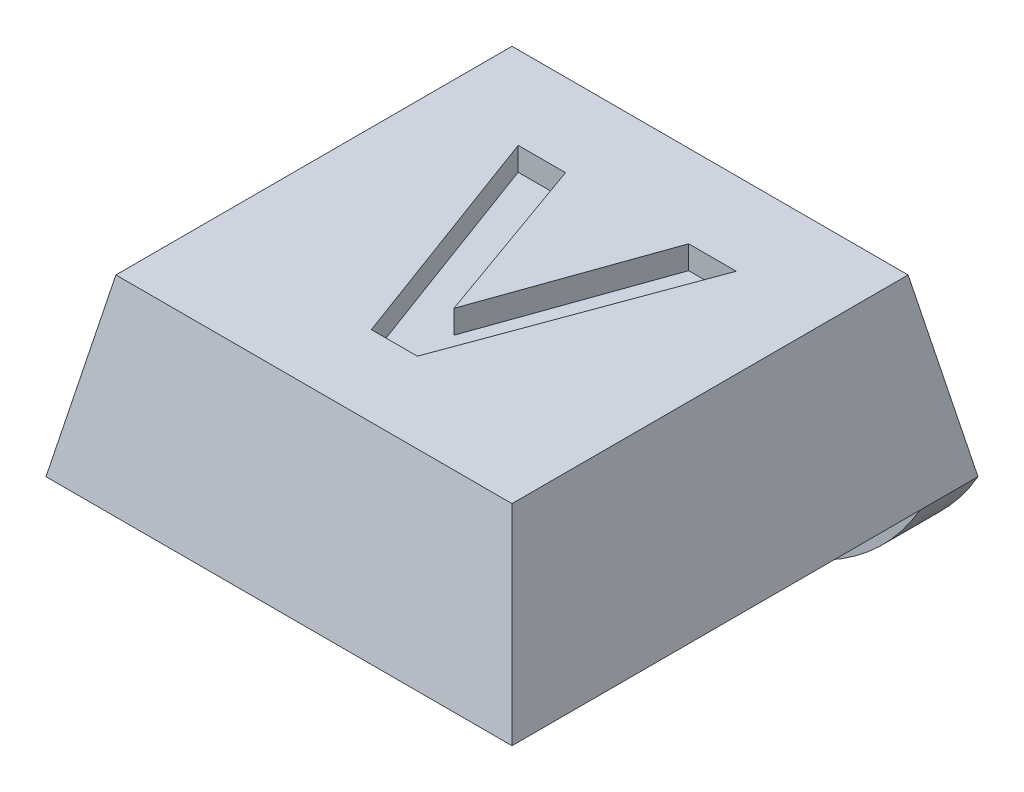
ISO-10303-21;
HEADER;
FILE_DESCRIPTION(('STEP AP214'),'2;1');
FILE_NAME('part.step','',(''),(''),'','','');
FILE_SCHEMA(('AUTOMOTIVE_DESIGN { 1 0 10303 214 1 1 1 1 }'));
ENDSEC;
DATA;
#1=APPLICATION_CONTEXT('core data for automotive mechanical design processes');
#2=APPLICATION_PROTOCOL_DEFINITION('international standard','automotive_design',2000,#1);
#3=PRODUCT_CONTEXT('',#1,'mechanical');
#4=PRODUCT('Part','Part','',(#3));
#5=PRODUCT_RELATED_PRODUCT_CATEGORY('part','',(#4));
#6=PRODUCT_DEFINITION_FORMATION('','',#4);
#7=PRODUCT_DEFINITION_CONTEXT('part definition',#1,'design');
#8=PRODUCT_DEFINITION('design','',#6,#7);
#9=PRODUCT_DEFINITION_SHAPE('','',#8);
#10=(LENGTH_UNIT() NAMED_UNIT(*) SI_UNIT(.MILLI.,.METRE.));
#11=(NAMED_UNIT(*) PLANE_ANGLE_UNIT() SI_UNIT($,.RADIAN.));
#12=(NAMED_UNIT(*) SI_UNIT($,.STERADIAN.) SOLID_ANGLE_UNIT());
#13=UNCERTAINTY_MEASURE_WITH_UNIT(LENGTH_MEASURE(1.E-05),#10,'distance_accuracy_value','');
#14=(GEOMETRIC_REPRESENTATION_CONTEXT(3) GLOBAL_UNCERTAINTY_ASSIGNED_CONTEXT((#13)) GLOBAL_UNIT_ASSIGNED_CONTEXT((#10,
#11,#12)) REPRESENTATION_CONTEXT('',''));
#15=CARTESIAN_POINT('',(0.,0.,0.));
#16=DIRECTION('',(0.,0.,1.));
#17=DIRECTION('',(1.,0.,0.));
#18=AXIS2_PLACEMENT_3D('',#15,#16,#17);
#19=CARTESIAN_POINT('',(0.,3.,0.));
#20=DIRECTION('',(0.,-1.,0.));
#21=DIRECTION('',(0.,0.,-1.));
#22=AXIS2_PLACEMENT_3D('',#19,#20,#21);
#23=PLANE('',#22);
#24=DIRECTION('',(-1.,0.,0.));
#25=VECTOR('',#24,1.);
#26=CARTESIAN_POINT('',(11.,3.,-0.6));
#27=LINE('',#26,#25);
#28=CARTESIAN_POINT('',(7.4,3.,-0.6));
#29=VERTEX_POINT('',#28);
#30=CARTESIAN_POINT('',(0.6,3.,-0.6));
#31=VERTEX_POINT('',#30);
#32=EDGE_CURVE('E200',#29,#31,#27,.T.);
#33=ORIENTED_EDGE('',*,*,#32,.F.);
#34=DIRECTION('',(0.,0.,1.));
#35=VECTOR('',#34,1.);
#36=CARTESIAN_POINT('',(7.4,3.,-8.));
#37=LINE('',#36,#35);
#38=CARTESIAN_POINT('',(7.4,3.,-7.4));
#39=VERTEX_POINT('',#38);
#40=EDGE_CURVE('E213',#39,#29,#37,.T.);
#41=ORIENTED_EDGE('',*,*,#40,.F.);
#42=DIRECTION('',(-1.,0.,0.));
#43=VECTOR('',#42,1.);
#44=CARTESIAN_POINT('',(11.,3.,-7.4));
#45=LINE('',#44,#43);
#46=CARTESIAN_POINT('',(0.599999999999999,3.,-7.4));
#47=VERTEX_POINT('',#46);
#48=EDGE_CURVE('E196',#39,#47,#45,.T.);
#49=ORIENTED_EDGE('',*,*,#48,.T.);
#50=DIRECTION('',(0.,0.,1.));
#51=VECTOR('',#50,1.);
#52=CARTESIAN_POINT('',(0.6,3.,-8.));
#53=LINE('',#52,#51);
#54=EDGE_CURVE('E216',#47,#31,#53,.T.);
#55=ORIENTED_EDGE('',*,*,#54,.T.);
#56=EDGE_LOOP('',(#33,#41,#49,#55));
#57=FACE_BOUND('',#56,.T.);
#58=DIRECTION('',(-1.,0.,0.));
#59=VECTOR('',#58,1.);
#60=CARTESIAN_POINT('',(4.39628987339704,3.,-1.97972373207462));
#61=LINE('',#60,#59);
#62=CARTESIAN_POINT('',(4.39628987339704,3.,-1.97972373207462));
#63=VERTEX_POINT('',#62);
#64=CARTESIAN_POINT('',(3.60542448878166,3.,-1.97972373207462));
#65=VERTEX_POINT('',#64);
#66=EDGE_CURVE('E59',#63,#65,#61,.T.);
#67=ORIENTED_EDGE('',*,*,#66,.T.);
#68=DIRECTION('',(-0.346837004095032,0.,-0.937925419524593));
#69=VECTOR('',#68,1.);
#70=CARTESIAN_POINT('',(3.60542448878166,3.,-1.97972373207462));
#71=LINE('',#70,#69);
#72=CARTESIAN_POINT('',(2.12625782211499,3.,-5.97972373207462));
#73=VERTEX_POINT('',#72);
#74=EDGE_CURVE('E168',#65,#73,#71,.T.);
#75=ORIENTED_EDGE('',*,*,#74,.T.);
#76=DIRECTION('',(1.,0.,0.));
#77=VECTOR('',#76,1.);
#78=CARTESIAN_POINT('',(2.12625782211499,3.,-5.97972373207462));
#79=LINE('',#78,#77);
#80=CARTESIAN_POINT('',(2.93875782211499,3.,-5.97972373207462));
#81=VERTEX_POINT('',#80);
#82=EDGE_CURVE('E562',#73,#81,#79,.T.);
#83=ORIENTED_EDGE('',*,*,#82,.T.);
#84=DIRECTION('',(0.335500275538548,0.,0.942040108017466));
#85=VECTOR('',#84,1.);
#86=CARTESIAN_POINT('',(2.93875782211499,3.,-5.97972373207462));
#87=LINE('',#86,#85);
#88=CARTESIAN_POINT('',(3.99805269390987,3.,-3.00536475771565));
#89=VERTEX_POINT('',#88);
#90=EDGE_CURVE('E543',#81,#89,#87,.T.);
#91=ORIENTED_EDGE('',*,*,#90,.T.);
#92=DIRECTION('',(0.33437347432051,0.,-0.942440650476639));
#93=VECTOR('',#92,1.);
#94=CARTESIAN_POINT('',(3.99805269390987,3.,-3.00536475771565));
#95=LINE('',#94,#93);
#96=CARTESIAN_POINT('',(5.05334115544833,3.,-5.97972373207462));
#97=VERTEX_POINT('',#96);
#98=EDGE_CURVE('E538',#89,#97,#95,.T.);
#99=ORIENTED_EDGE('',*,*,#98,.T.);
#100=DIRECTION('',(1.,0.,0.));
#101=VECTOR('',#100,1.);
#102=CARTESIAN_POINT('',(5.05334115544833,3.,-5.97972373207462));
#103=LINE('',#102,#101);
#104=CARTESIAN_POINT('',(5.86984756570474,3.,-5.97972373207462));
#105=VERTEX_POINT('',#104);
#106=EDGE_CURVE('E532',#97,#105,#103,.T.);
#107=ORIENTED_EDGE('',*,*,#106,.T.);
#108=DIRECTION('',(-0.345679226097517,0.,0.93835274425166));
#109=VECTOR('',#108,1.);
#110=CARTESIAN_POINT('',(5.86984756570474,3.,-5.97972373207462));
#111=LINE('',#110,#109);
#112=EDGE_CURVE('E164',#105,#63,#111,.T.);
#113=ORIENTED_EDGE('',*,*,#112,.T.);
#114=EDGE_LOOP('',(#67,#75,#83,#91,#99,#107,#113));
#115=FACE_BOUND('',#114,.T.);
#116=ADVANCED_FACE('F43',(#57,#115),#23,.F.);
#117=CARTESIAN_POINT('',(8.,0.,-8.));
#118=DIRECTION('',(-0.98058067569092,-0.196116135138184,0.));
#119=DIRECTION('',(0.196116135138184,-0.98058067569092,0.));
#120=AXIS2_PLACEMENT_3D('',#117,#118,#119);
#121=PLANE('',#120);
#122=DIRECTION('',(-0.192450089729875,0.962250448649376,-0.192450089729875));
#123=VECTOR('',#122,1.);
#124=CARTESIAN_POINT('',(7.7037037037037,1.48148148148148,-0.296296296296296));
#125=LINE('',#124,#123);
#126=CARTESIAN_POINT('',(8.,0.,0.));
#127=VERTEX_POINT('',#126);
#128=EDGE_CURVE('E210',#127,#29,#125,.T.);
#129=ORIENTED_EDGE('',*,*,#128,.F.);
#130=DIRECTION('',(0.,0.,-1.));
#131=VECTOR('',#130,1.);
#132=CARTESIAN_POINT('',(8.,0.,0.));
#133=LINE('',#132,#131);
#134=CARTESIAN_POINT('',(8.,0.,-7.));
#135=VERTEX_POINT('',#134);
#136=EDGE_CURVE('E229',#127,#135,#133,.T.);
#137=ORIENTED_EDGE('',*,*,#136,.T.);
#138=DIRECTION('',(0.,0.,1.));
#139=VECTOR('',#138,1.);
#140=CARTESIAN_POINT('',(8.,0.,-8.));
#141=LINE('',#140,#139);
#142=CARTESIAN_POINT('',(8.,0.,-8.));
#143=VERTEX_POINT('',#142);
#144=EDGE_CURVE('E170',#143,#135,#141,.T.);
#145=ORIENTED_EDGE('',*,*,#144,.F.);
#146=DIRECTION('',(0.192450089729875,-0.962250448649376,-0.192450089729875));
#147=VECTOR('',#146,1.);
#148=CARTESIAN_POINT('',(8.,0.,-8.));
#149=LINE('',#148,#147);
#150=EDGE_CURVE('E203',#39,#143,#149,.T.);
#151=ORIENTED_EDGE('',*,*,#150,.F.);
#152=ORIENTED_EDGE('',*,*,#40,.T.);
#153=EDGE_LOOP('',(#129,#137,#145,#151,#152));
#154=FACE_BOUND('',#153,.T.);
#155=ADVANCED_FACE('F297',(#154),#121,.F.);
#156=CARTESIAN_POINT('',(0.,0.,-8.));
#157=DIRECTION('',(0.98058067569092,-0.196116135138184,0.));
#158=DIRECTION('',(0.196116135138184,0.98058067569092,0.));
#159=AXIS2_PLACEMENT_3D('',#156,#157,#158);
#160=PLANE('',#159);
#161=DIRECTION('',(-0.192450089729875,-0.962250448649376,0.192450089729875));
#162=VECTOR('',#161,1.);
#163=CARTESIAN_POINT('',(0.296296296296296,1.48148148148148,-0.296296296296296));
#164=LINE('',#163,#162);
#165=CARTESIAN_POINT('',(0.,0.,0.));
#166=VERTEX_POINT('',#165);
#167=EDGE_CURVE('E257',#31,#166,#164,.T.);
#168=ORIENTED_EDGE('',*,*,#167,.F.);
#169=ORIENTED_EDGE('',*,*,#54,.F.);
#170=DIRECTION('',(0.192450089729875,0.962250448649376,0.192450089729875));
#171=VECTOR('',#170,1.);
#172=CARTESIAN_POINT('',(0.,0.,-8.));
#173=LINE('',#172,#171);
#174=CARTESIAN_POINT('',(0.,0.,-8.));
#175=VERTEX_POINT('',#174);
#176=EDGE_CURVE('E228',#175,#47,#173,.T.);
#177=ORIENTED_EDGE('',*,*,#176,.F.);
#178=DIRECTION('',(0.,0.,1.));
#179=VECTOR('',#178,1.);
#180=CARTESIAN_POINT('',(0.,0.,0.));
#181=LINE('',#180,#179);
#182=CARTESIAN_POINT('',(0.,0.,-7.));
#183=VERTEX_POINT('',#182);
#184=EDGE_CURVE('E233',#175,#183,#181,.T.);
#185=ORIENTED_EDGE('',*,*,#184,.T.);
#186=EDGE_CURVE('E220',#183,#166,#181,.T.);
#187=ORIENTED_EDGE('',*,*,#186,.T.);
#188=EDGE_LOOP('',(#168,#169,#177,#185,#187));
#189=FACE_BOUND('',#188,.T.);
#190=ADVANCED_FACE('F281',(#189),#160,.F.);
#191=CARTESIAN_POINT('',(0.,0.,0.));
#192=DIRECTION('',(0.,-1.,0.));
#193=DIRECTION('',(0.,0.,-1.));
#194=AXIS2_PLACEMENT_3D('',#191,#192,#193);
#195=PLANE('',#194);
#196=DIRECTION('',(-1.,0.,0.));
#197=VECTOR('',#196,1.);
#198=CARTESIAN_POINT('',(0.,0.,-7.));
#199=LINE('',#198,#197);
#200=EDGE_CURVE('E176',#135,#183,#199,.T.);
#201=ORIENTED_EDGE('',*,*,#200,.F.);
#202=ORIENTED_EDGE('',*,*,#136,.F.);
#203=DIRECTION('',(1.,0.,0.));
#204=VECTOR('',#203,1.);
#205=CARTESIAN_POINT('',(0.,0.,0.));
#206=LINE('',#205,#204);
#207=EDGE_CURVE('E230',#166,#127,#206,.T.);
#208=ORIENTED_EDGE('',*,*,#207,.F.);
#209=ORIENTED_EDGE('',*,*,#186,.F.);
#210=EDGE_LOOP('',(#201,#202,#208,#209));
#211=FACE_BOUND('',#210,.T.);
#212=CARTESIAN_POINT('',(4.,0.,-3.75));
#213=DIRECTION('',(0.,-1.,0.));
#214=DIRECTION('',(0.,0.,-1.));
#215=AXIS2_PLACEMENT_3D('',#212,#213,#214);
#216=CIRCLE('',#215,1.75);
#217=CARTESIAN_POINT('',(4.,0.,-5.5));
#218=VERTEX_POINT('',#217);
#219=EDGE_CURVE('E188',#218,#218,#216,.T.);
#220=ORIENTED_EDGE('',*,*,#219,.F.);
#221=EDGE_LOOP('',(#220));
#222=FACE_BOUND('',#221,.T.);
#223=ADVANCED_FACE('F292',(#211,#222),#195,.T.);
#224=CARTESIAN_POINT('',(11.,3.,-7.4));
#225=DIRECTION('',(0.,0.196116135138184,-0.98058067569092));
#226=DIRECTION('',(0.,0.98058067569092,0.196116135138184));
#227=AXIS2_PLACEMENT_3D('',#224,#225,#226);
#228=PLANE('',#227);
#229=ORIENTED_EDGE('',*,*,#150,.T.);
#230=DIRECTION('',(-1.,0.,0.));
#231=VECTOR('',#230,1.);
#232=CARTESIAN_POINT('',(0.,0.,-8.));
#233=LINE('',#232,#231);
#234=EDGE_CURVE('E224',#143,#175,#233,.T.);
#235=ORIENTED_EDGE('',*,*,#234,.T.);
#236=ORIENTED_EDGE('',*,*,#176,.T.);
#237=ORIENTED_EDGE('',*,*,#48,.F.);
#238=EDGE_LOOP('',(#229,#235,#236,#237));
#239=FACE_BOUND('',#238,.T.);
#240=ADVANCED_FACE('F276',(#239),#228,.T.);
#241=CARTESIAN_POINT('',(11.,0.,0.));
#242=DIRECTION('',(0.,0.196116135138184,0.98058067569092));
#243=DIRECTION('',(0.,-0.98058067569092,0.196116135138184));
#244=AXIS2_PLACEMENT_3D('',#241,#242,#243);
#245=PLANE('',#244);
#246=ORIENTED_EDGE('',*,*,#128,.T.);
#247=ORIENTED_EDGE('',*,*,#32,.T.);
#248=ORIENTED_EDGE('',*,*,#167,.T.);
#249=ORIENTED_EDGE('',*,*,#207,.T.);
#250=EDGE_LOOP('',(#246,#247,#248,#249));
#251=FACE_BOUND('',#250,.T.);
#252=ADVANCED_FACE('F321',(#251),#245,.T.);
#253=CARTESIAN_POINT('',(4.,0.4,-3.75));
#254=DIRECTION('',(0.,-1.,0.));
#255=DIRECTION('',(0.,0.,-1.));
#256=AXIS2_PLACEMENT_3D('',#253,#254,#255);
#257=CYLINDRICAL_SURFACE('',#256,1.75);
#258=CARTESIAN_POINT('',(4.,0.4,-3.75));
#259=DIRECTION('',(0.,-1.,0.));
#260=DIRECTION('',(0.,0.,-1.));
#261=AXIS2_PLACEMENT_3D('',#258,#259,#260);
#262=CIRCLE('',#261,1.75);
#263=CARTESIAN_POINT('',(4.,0.4,-5.5));
#264=VERTEX_POINT('',#263);
#265=EDGE_CURVE('E192',#264,#264,#262,.T.);
#266=ORIENTED_EDGE('',*,*,#265,.F.);
#267=EDGE_LOOP('',(#266));
#268=FACE_BOUND('',#267,.T.);
#269=ORIENTED_EDGE('',*,*,#219,.T.);
#270=EDGE_LOOP('',(#269));
#271=FACE_BOUND('',#270,.T.);
#272=ADVANCED_FACE('F328',(#268,#271),#257,.F.);
#273=CARTESIAN_POINT('',(4.,0.4,-3.75));
#274=DIRECTION('',(0.,-1.,0.));
#275=DIRECTION('',(0.,0.,-1.));
#276=AXIS2_PLACEMENT_3D('',#273,#274,#275);
#277=PLANE('',#276);
#278=ORIENTED_EDGE('',*,*,#265,.T.);
#279=EDGE_LOOP('',(#278));
#280=FACE_BOUND('',#279,.T.);
#281=ADVANCED_FACE('F332',(#280),#277,.T.);
#282=CARTESIAN_POINT('',(0.,-2.,-8.));
#283=DIRECTION('',(0.,0.,1.));
#284=DIRECTION('',(1.,0.,0.));
#285=AXIS2_PLACEMENT_3D('',#282,#283,#284);
#286=PLANE('',#285);
#287=ORIENTED_EDGE('',*,*,#234,.F.);
#288=CARTESIAN_POINT('',(4.53589838486225,2.,-8.));
#289=DIRECTION('',(0.,0.,1.));
#290=DIRECTION('',(1.,0.,0.));
#291=AXIS2_PLACEMENT_3D('',#288,#289,#290);
#292=CIRCLE('',#291,4.);
#293=CARTESIAN_POINT('',(4.53589838486225,-2.,-8.));
#294=VERTEX_POINT('',#293);
#295=EDGE_CURVE('E11',#143,#294,#292,.F.);
#296=ORIENTED_EDGE('',*,*,#295,.T.);
#297=DIRECTION('',(1.,0.,0.));
#298=VECTOR('',#297,1.);
#299=CARTESIAN_POINT('',(0.,-2.,-8.));
#300=LINE('',#299,#298);
#301=CARTESIAN_POINT('',(3.46410161513775,-2.,-8.));
#302=VERTEX_POINT('',#301);
#303=EDGE_CURVE('E182',#302,#294,#300,.T.);
#304=ORIENTED_EDGE('',*,*,#303,.F.);
#305=CARTESIAN_POINT('',(3.46410161513775,2.,-8.));
#306=DIRECTION('',(0.,0.,1.));
#307=DIRECTION('',(1.,0.,0.));
#308=AXIS2_PLACEMENT_3D('',#305,#306,#307);
#309=CIRCLE('',#308,4.);
#310=EDGE_CURVE('E52',#302,#175,#309,.F.);
#311=ORIENTED_EDGE('',*,*,#310,.T.);
#312=EDGE_LOOP('',(#287,#296,#304,#311));
#313=FACE_BOUND('',#312,.T.);
#314=ADVANCED_FACE('F269',(#313),#286,.F.);
#315=CARTESIAN_POINT('',(0.,-2.,-7.));
#316=DIRECTION('',(0.,0.,-1.));
#317=DIRECTION('',(-1.,0.,0.));
#318=AXIS2_PLACEMENT_3D('',#315,#316,#317);
#319=PLANE('',#318);
#320=DIRECTION('',(-1.,0.,0.));
#321=VECTOR('',#320,1.);
#322=CARTESIAN_POINT('',(0.,-2.,-7.));
#323=LINE('',#322,#321);
#324=CARTESIAN_POINT('',(4.53589838486225,-2.,-7.));
#325=VERTEX_POINT('',#324);
#326=CARTESIAN_POINT('',(3.46410161513775,-2.,-7.));
#327=VERTEX_POINT('',#326);
#328=EDGE_CURVE('E186',#325,#327,#323,.T.);
#329=ORIENTED_EDGE('',*,*,#328,.F.);
#330=CARTESIAN_POINT('',(4.53589838486225,2.,-7.));
#331=DIRECTION('',(0.,0.,-1.));
#332=DIRECTION('',(-1.,0.,0.));
#333=AXIS2_PLACEMENT_3D('',#330,#331,#332);
#334=CIRCLE('',#333,4.);
#335=EDGE_CURVE('E263',#325,#135,#334,.F.);
#336=ORIENTED_EDGE('',*,*,#335,.T.);
#337=ORIENTED_EDGE('',*,*,#200,.T.);
#338=CARTESIAN_POINT('',(3.46410161513775,2.,-7.));
#339=DIRECTION('',(0.,0.,-1.));
#340=DIRECTION('',(-1.,0.,0.));
#341=AXIS2_PLACEMENT_3D('',#338,#339,#340);
#342=CIRCLE('',#341,4.);
#343=EDGE_CURVE('E67',#183,#327,#342,.F.);
#344=ORIENTED_EDGE('',*,*,#343,.T.);
#345=EDGE_LOOP('',(#329,#336,#337,#344));
#346=FACE_BOUND('',#345,.T.);
#347=ADVANCED_FACE('F287',(#346),#319,.F.);
#348=CARTESIAN_POINT('',(0.,-2.,0.));
#349=DIRECTION('',(0.,1.,0.));
#350=DIRECTION('',(0.,0.,1.));
#351=AXIS2_PLACEMENT_3D('',#348,#349,#350);
#352=PLANE('',#351);
#353=ORIENTED_EDGE('',*,*,#303,.T.);
#354=DIRECTION('',(0.,0.,1.));
#355=VECTOR('',#354,1.);
#356=CARTESIAN_POINT('',(4.53589838486225,-2.,0.));
#357=LINE('',#356,#355);
#358=EDGE_CURVE('E256',#294,#325,#357,.T.);
#359=ORIENTED_EDGE('',*,*,#358,.T.);
#360=ORIENTED_EDGE('',*,*,#328,.T.);
#361=DIRECTION('',(0.,0.,-1.));
#362=VECTOR('',#361,1.);
#363=CARTESIAN_POINT('',(3.46410161513775,-2.,0.));
#364=LINE('',#363,#362);
#365=EDGE_CURVE('E252',#327,#302,#364,.T.);
#366=ORIENTED_EDGE('',*,*,#365,.T.);
#367=EDGE_LOOP('',(#353,#359,#360,#366));
#368=FACE_BOUND('',#367,.T.);
#369=ADVANCED_FACE('F285',(#368),#352,.F.);
#370=CARTESIAN_POINT('',(4.53589838486225,2.,-8.));
#371=DIRECTION('',(0.,0.,1.));
#372=DIRECTION('',(1.,0.,0.));
#373=AXIS2_PLACEMENT_3D('',#370,#371,#372);
#374=CYLINDRICAL_SURFACE('',#373,4.);
#375=ORIENTED_EDGE('',*,*,#295,.F.);
#376=ORIENTED_EDGE('',*,*,#144,.T.);
#377=ORIENTED_EDGE('',*,*,#335,.F.);
#378=ORIENTED_EDGE('',*,*,#358,.F.);
#379=EDGE_LOOP('',(#375,#376,#377,#378));
#380=FACE_BOUND('',#379,.T.);
#381=ADVANCED_FACE('F298',(#380),#374,.T.);
#382=CARTESIAN_POINT('',(3.46410161513775,2.,-8.));
#383=DIRECTION('',(0.,0.,-1.));
#384=DIRECTION('',(-1.,0.,0.));
#385=AXIS2_PLACEMENT_3D('',#382,#383,#384);
#386=CYLINDRICAL_SURFACE('',#385,4.);
#387=ORIENTED_EDGE('',*,*,#343,.F.);
#388=ORIENTED_EDGE('',*,*,#184,.F.);
#389=ORIENTED_EDGE('',*,*,#310,.F.);
#390=ORIENTED_EDGE('',*,*,#365,.F.);
#391=EDGE_LOOP('',(#387,#388,#389,#390));
#392=FACE_BOUND('',#391,.T.);
#393=ADVANCED_FACE('F45',(#392),#386,.T.);
#394=CARTESIAN_POINT('',(4.39628987339704,2.6,-1.97972373207462));
#395=DIRECTION('',(0.,0.,-1.));
#396=DIRECTION('',(-1.,0.,0.));
#397=AXIS2_PLACEMENT_3D('',#394,#395,#396);
#398=PLANE('',#397);
#399=ORIENTED_EDGE('',*,*,#66,.F.);
#400=DIRECTION('',(0.,1.,0.));
#401=VECTOR('',#400,1.);
#402=CARTESIAN_POINT('',(4.39628987339704,2.6,-1.97972373207462));
#403=LINE('',#402,#401);
#404=CARTESIAN_POINT('',(4.39628987339704,2.6,-1.97972373207462));
#405=VERTEX_POINT('',#404);
#406=EDGE_CURVE('E162',#405,#63,#403,.T.);
#407=ORIENTED_EDGE('',*,*,#406,.F.);
#408=DIRECTION('',(-1.,0.,0.));
#409=VECTOR('',#408,1.);
#410=CARTESIAN_POINT('',(4.39628987339704,2.6,-1.97972373207462));
#411=LINE('',#410,#409);
#412=CARTESIAN_POINT('',(3.60542448878166,2.6,-1.97972373207462));
#413=VERTEX_POINT('',#412);
#414=EDGE_CURVE('E152',#405,#413,#411,.T.);
#415=ORIENTED_EDGE('',*,*,#414,.T.);
#416=DIRECTION('',(0.,1.,0.));
#417=VECTOR('',#416,1.);
#418=CARTESIAN_POINT('',(3.60542448878166,2.6,-1.97972373207462));
#419=LINE('',#418,#417);
#420=EDGE_CURVE('E161',#413,#65,#419,.T.);
#421=ORIENTED_EDGE('',*,*,#420,.T.);
#422=EDGE_LOOP('',(#399,#407,#415,#421));
#423=FACE_BOUND('',#422,.T.);
#424=ADVANCED_FACE('F160',(#423),#398,.T.);
#425=CARTESIAN_POINT('',(3.60542448878166,2.6,-1.97972373207462));
#426=DIRECTION('',(0.937925419524593,0.,-0.346837004095032));
#427=DIRECTION('',(-0.346837004095032,0.,-0.937925419524593));
#428=AXIS2_PLACEMENT_3D('',#425,#426,#427);
#429=PLANE('',#428);
#430=ORIENTED_EDGE('',*,*,#74,.F.);
#431=ORIENTED_EDGE('',*,*,#420,.F.);
#432=DIRECTION('',(-0.346837004095032,0.,-0.937925419524593));
#433=VECTOR('',#432,1.);
#434=CARTESIAN_POINT('',(3.60542448878166,2.6,-1.97972373207462));
#435=LINE('',#434,#433);
#436=CARTESIAN_POINT('',(2.12625782211499,2.6,-5.97972373207462));
#437=VERTEX_POINT('',#436);
#438=EDGE_CURVE('E148',#413,#437,#435,.T.);
#439=ORIENTED_EDGE('',*,*,#438,.T.);
#440=DIRECTION('',(0.,1.,0.));
#441=VECTOR('',#440,1.);
#442=CARTESIAN_POINT('',(2.12625782211499,2.6,-5.97972373207462));
#443=LINE('',#442,#441);
#444=EDGE_CURVE('E171',#437,#73,#443,.T.);
#445=ORIENTED_EDGE('',*,*,#444,.T.);
#446=EDGE_LOOP('',(#430,#431,#439,#445));
#447=FACE_BOUND('',#446,.T.);
#448=ADVANCED_FACE('F166',(#447),#429,.T.);
#449=CARTESIAN_POINT('',(2.12625782211499,2.6,-5.97972373207462));
#450=DIRECTION('',(0.,0.,1.));
#451=DIRECTION('',(1.,0.,0.));
#452=AXIS2_PLACEMENT_3D('',#449,#450,#451);
#453=PLANE('',#452);
#454=ORIENTED_EDGE('',*,*,#82,.F.);
#455=ORIENTED_EDGE('',*,*,#444,.F.);
#456=DIRECTION('',(1.,0.,0.));
#457=VECTOR('',#456,1.);
#458=CARTESIAN_POINT('',(2.12625782211499,2.6,-5.97972373207462));
#459=LINE('',#458,#457);
#460=CARTESIAN_POINT('',(2.93875782211499,2.6,-5.97972373207462));
#461=VERTEX_POINT('',#460);
#462=EDGE_CURVE('E154',#437,#461,#459,.T.);
#463=ORIENTED_EDGE('',*,*,#462,.T.);
#464=DIRECTION('',(0.,1.,0.));
#465=VECTOR('',#464,1.);
#466=CARTESIAN_POINT('',(2.93875782211499,2.6,-5.97972373207462));
#467=LINE('',#466,#465);
#468=EDGE_CURVE('E178',#461,#81,#467,.T.);
#469=ORIENTED_EDGE('',*,*,#468,.T.);
#470=EDGE_LOOP('',(#454,#455,#463,#469));
#471=FACE_BOUND('',#470,.T.);
#472=ADVANCED_FACE('F345',(#471),#453,.T.);
#473=CARTESIAN_POINT('',(2.93875782211499,2.6,-5.97972373207462));
#474=DIRECTION('',(-0.942040108017466,0.,0.335500275538548));
#475=DIRECTION('',(0.335500275538548,0.,0.942040108017466));
#476=AXIS2_PLACEMENT_3D('',#473,#474,#475);
#477=PLANE('',#476);
#478=ORIENTED_EDGE('',*,*,#90,.F.);
#479=ORIENTED_EDGE('',*,*,#468,.F.);
#480=DIRECTION('',(0.335500275538548,0.,0.942040108017466));
#481=VECTOR('',#480,1.);
#482=CARTESIAN_POINT('',(2.93875782211499,2.6,-5.97972373207462));
#483=LINE('',#482,#481);
#484=CARTESIAN_POINT('',(3.99805269390987,2.6,-3.00536475771565));
#485=VERTEX_POINT('',#484);
#486=EDGE_CURVE('E580',#461,#485,#483,.T.);
#487=ORIENTED_EDGE('',*,*,#486,.T.);
#488=DIRECTION('',(0.,1.,0.));
#489=VECTOR('',#488,1.);
#490=CARTESIAN_POINT('',(3.99805269390987,2.6,-3.00536475771565));
#491=LINE('',#490,#489);
#492=EDGE_CURVE('E555',#485,#89,#491,.T.);
#493=ORIENTED_EDGE('',*,*,#492,.T.);
#494=EDGE_LOOP('',(#478,#479,#487,#493));
#495=FACE_BOUND('',#494,.T.);
#496=ADVANCED_FACE('F348',(#495),#477,.T.);
#497=CARTESIAN_POINT('',(3.99805269390987,2.6,-3.00536475771565));
#498=DIRECTION('',(0.942440650476639,0.,0.33437347432051));
#499=DIRECTION('',(0.33437347432051,0.,-0.942440650476639));
#500=AXIS2_PLACEMENT_3D('',#497,#498,#499);
#501=PLANE('',#500);
#502=ORIENTED_EDGE('',*,*,#98,.F.);
#503=ORIENTED_EDGE('',*,*,#492,.F.);
#504=DIRECTION('',(0.33437347432051,0.,-0.942440650476639));
#505=VECTOR('',#504,1.);
#506=CARTESIAN_POINT('',(3.99805269390987,2.6,-3.00536475771565));
#507=LINE('',#506,#505);
#508=CARTESIAN_POINT('',(5.05334115544833,2.6,-5.97972373207462));
#509=VERTEX_POINT('',#508);
#510=EDGE_CURVE('E577',#485,#509,#507,.T.);
#511=ORIENTED_EDGE('',*,*,#510,.T.);
#512=DIRECTION('',(0.,1.,0.));
#513=VECTOR('',#512,1.);
#514=CARTESIAN_POINT('',(5.05334115544833,2.6,-5.97972373207462));
#515=LINE('',#514,#513);
#516=EDGE_CURVE('E552',#509,#97,#515,.T.);
#517=ORIENTED_EDGE('',*,*,#516,.T.);
#518=EDGE_LOOP('',(#502,#503,#511,#517));
#519=FACE_BOUND('',#518,.T.);
#520=ADVANCED_FACE('F352',(#519),#501,.T.);
#521=CARTESIAN_POINT('',(5.05334115544833,2.6,-5.97972373207462));
#522=DIRECTION('',(0.,0.,1.));
#523=DIRECTION('',(1.,0.,0.));
#524=AXIS2_PLACEMENT_3D('',#521,#522,#523);
#525=PLANE('',#524);
#526=ORIENTED_EDGE('',*,*,#106,.F.);
#527=ORIENTED_EDGE('',*,*,#516,.F.);
#528=DIRECTION('',(1.,0.,0.));
#529=VECTOR('',#528,1.);
#530=CARTESIAN_POINT('',(5.05334115544833,2.6,-5.97972373207462));
#531=LINE('',#530,#529);
#532=CARTESIAN_POINT('',(5.86984756570474,2.6,-5.97972373207462));
#533=VERTEX_POINT('',#532);
#534=EDGE_CURVE('E574',#509,#533,#531,.T.);
#535=ORIENTED_EDGE('',*,*,#534,.T.);
#536=DIRECTION('',(0.,1.,0.));
#537=VECTOR('',#536,1.);
#538=CARTESIAN_POINT('',(5.86984756570474,2.6,-5.97972373207462));
#539=LINE('',#538,#537);
#540=EDGE_CURVE('E530',#533,#105,#539,.T.);
#541=ORIENTED_EDGE('',*,*,#540,.T.);
#542=EDGE_LOOP('',(#526,#527,#535,#541));
#543=FACE_BOUND('',#542,.T.);
#544=ADVANCED_FACE('F356',(#543),#525,.T.);
#545=CARTESIAN_POINT('',(5.86984756570474,2.6,-5.97972373207462));
#546=DIRECTION('',(-0.93835274425166,0.,-0.345679226097517));
#547=DIRECTION('',(-0.345679226097517,0.,0.93835274425166));
#548=AXIS2_PLACEMENT_3D('',#545,#546,#547);
#549=PLANE('',#548);
#550=ORIENTED_EDGE('',*,*,#112,.F.);
#551=ORIENTED_EDGE('',*,*,#540,.F.);
#552=DIRECTION('',(-0.345679226097517,0.,0.93835274425166));
#553=VECTOR('',#552,1.);
#554=CARTESIAN_POINT('',(5.86984756570474,2.6,-5.97972373207462));
#555=LINE('',#554,#553);
#556=EDGE_CURVE('E549',#533,#405,#555,.T.);
#557=ORIENTED_EDGE('',*,*,#556,.T.);
#558=ORIENTED_EDGE('',*,*,#406,.T.);
#559=EDGE_LOOP('',(#550,#551,#557,#558));
#560=FACE_BOUND('',#559,.T.);
#561=ADVANCED_FACE('F360',(#560),#549,.T.);
#562=CARTESIAN_POINT('',(0.,2.6,0.));
#563=DIRECTION('',(0.,-1.,0.));
#564=DIRECTION('',(0.,0.,-1.));
#565=AXIS2_PLACEMENT_3D('',#562,#563,#564);
#566=PLANE('',#565);
#567=ORIENTED_EDGE('',*,*,#414,.F.);
#568=ORIENTED_EDGE('',*,*,#556,.F.);
#569=ORIENTED_EDGE('',*,*,#534,.F.);
#570=ORIENTED_EDGE('',*,*,#510,.F.);
#571=ORIENTED_EDGE('',*,*,#486,.F.);
#572=ORIENTED_EDGE('',*,*,#462,.F.);
#573=ORIENTED_EDGE('',*,*,#438,.F.);
#574=EDGE_LOOP('',(#567,#568,#569,#570,#571,#572,#573));
#575=FACE_BOUND('',#574,.T.);
#576=ADVANCED_FACE('F150',(#575),#566,.F.);
#577=CLOSED_SHELL('',(#116,#155,#190,#223,#240,#252,#272,#281,#314,#347,#369,#381,#393,#424,
#448,#472,#496,#520,#544,#561,#576));
#578=MANIFOLD_SOLID_BREP('B2',#577);
#579=ADVANCED_BREP_SHAPE_REPRESENTATION('',(#18,#578),#14);
#580=SHAPE_DEFINITION_REPRESENTATION(#9,#579);
ENDSEC;
END-ISO-10303-21;
